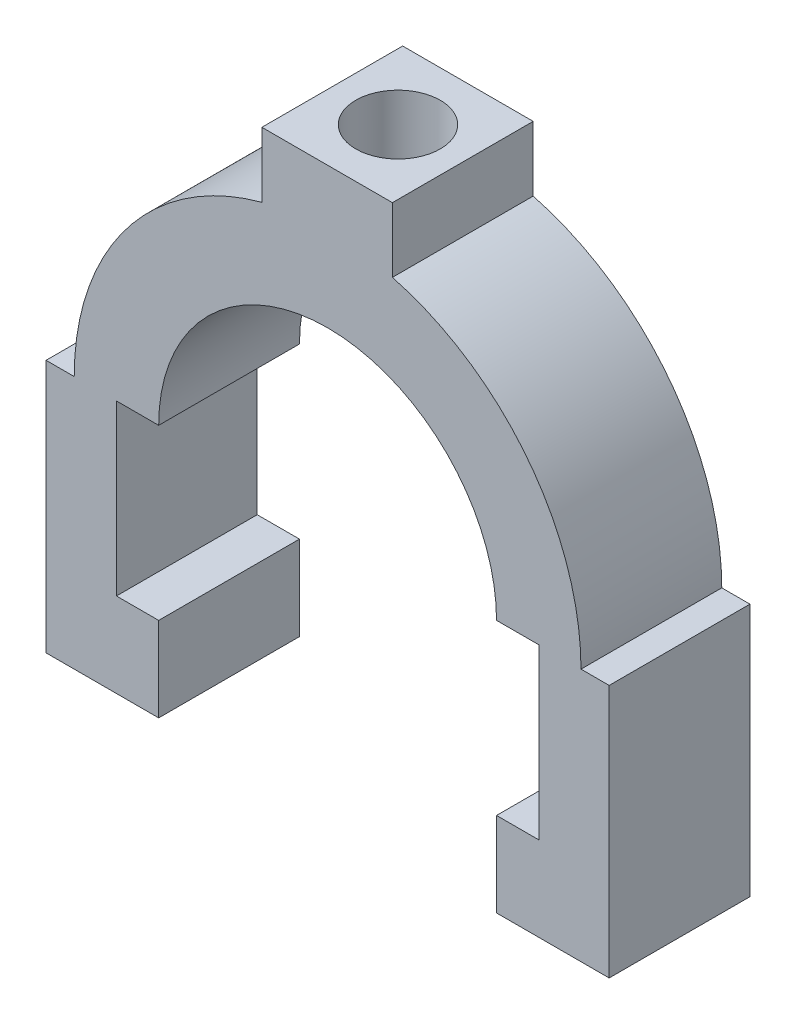
ISO-10303-21;
HEADER;
FILE_DESCRIPTION(('STEP AP214'),'2;1');
FILE_NAME('part.step','',(''),(''),'','','');
FILE_SCHEMA(('AUTOMOTIVE_DESIGN { 1 0 10303 214 1 1 1 1 }'));
ENDSEC;
DATA;
#1=APPLICATION_CONTEXT('core data for automotive mechanical design processes');
#2=APPLICATION_PROTOCOL_DEFINITION('international standard','automotive_design',2000,#1);
#3=PRODUCT_CONTEXT('',#1,'mechanical');
#4=PRODUCT('Part','Part','',(#3));
#5=PRODUCT_RELATED_PRODUCT_CATEGORY('part','',(#4));
#6=PRODUCT_DEFINITION_FORMATION('','',#4);
#7=PRODUCT_DEFINITION_CONTEXT('part definition',#1,'design');
#8=PRODUCT_DEFINITION('design','',#6,#7);
#9=PRODUCT_DEFINITION_SHAPE('','',#8);
#10=(LENGTH_UNIT() NAMED_UNIT(*) SI_UNIT(.MILLI.,.METRE.));
#11=(NAMED_UNIT(*) PLANE_ANGLE_UNIT() SI_UNIT($,.RADIAN.));
#12=(NAMED_UNIT(*) SI_UNIT($,.STERADIAN.) SOLID_ANGLE_UNIT());
#13=UNCERTAINTY_MEASURE_WITH_UNIT(LENGTH_MEASURE(1.E-05),#10,'distance_accuracy_value','');
#14=(GEOMETRIC_REPRESENTATION_CONTEXT(3) GLOBAL_UNCERTAINTY_ASSIGNED_CONTEXT((#13)) GLOBAL_UNIT_ASSIGNED_CONTEXT((#10,
#11,#12)) REPRESENTATION_CONTEXT('',''));
#15=CARTESIAN_POINT('',(0.,0.,0.));
#16=DIRECTION('',(0.,0.,1.));
#17=DIRECTION('',(1.,0.,0.));
#18=AXIS2_PLACEMENT_3D('',#15,#16,#17);
#19=CARTESIAN_POINT('',(0.,0.,20.));
#20=DIRECTION('',(0.,0.,-1.));
#21=DIRECTION('',(-1.,0.,0.));
#22=AXIS2_PLACEMENT_3D('',#19,#20,#21);
#23=CYLINDRICAL_SURFACE('',#22,36.);
#24=CARTESIAN_POINT('',(0.,0.,0.));
#25=DIRECTION('',(0.,0.,1.));
#26=DIRECTION('',(1.,0.,0.));
#27=AXIS2_PLACEMENT_3D('',#24,#25,#26);
#28=CIRCLE('',#27,36.);
#29=CARTESIAN_POINT('',(36.,0.,0.));
#30=VERTEX_POINT('',#29);
#31=CARTESIAN_POINT('',(9.20522365839567,34.8032161933192,0.));
#32=VERTEX_POINT('',#31);
#33=EDGE_CURVE('E227',#30,#32,#28,.T.);
#34=ORIENTED_EDGE('',*,*,#33,.T.);
#35=DIRECTION('',(0.,0.,-1.));
#36=VECTOR('',#35,1.);
#37=CARTESIAN_POINT('',(9.20522365839567,34.8032161933192,20.));
#38=LINE('',#37,#36);
#39=CARTESIAN_POINT('',(9.20522365839567,34.8032161933192,20.));
#40=VERTEX_POINT('',#39);
#41=EDGE_CURVE('E11',#40,#32,#38,.T.);
#42=ORIENTED_EDGE('',*,*,#41,.F.);
#43=CARTESIAN_POINT('',(0.,0.,20.));
#44=DIRECTION('',(0.,0.,1.));
#45=DIRECTION('',(1.,0.,0.));
#46=AXIS2_PLACEMENT_3D('',#43,#44,#45);
#47=CIRCLE('',#46,36.);
#48=CARTESIAN_POINT('',(36.,0.,20.));
#49=VERTEX_POINT('',#48);
#50=EDGE_CURVE('E279',#49,#40,#47,.T.);
#51=ORIENTED_EDGE('',*,*,#50,.F.);
#52=DIRECTION('',(0.,0.,-1.));
#53=VECTOR('',#52,1.);
#54=CARTESIAN_POINT('',(36.,0.,20.));
#55=LINE('',#54,#53);
#56=EDGE_CURVE('E75',#49,#30,#55,.T.);
#57=ORIENTED_EDGE('',*,*,#56,.T.);
#58=EDGE_LOOP('',(#34,#42,#51,#57));
#59=FACE_BOUND('',#58,.T.);
#60=ADVANCED_FACE('F53',(#59),#23,.T.);
#61=CARTESIAN_POINT('',(9.20522365839566,0.,20.));
#62=DIRECTION('',(-1.,0.,0.));
#63=DIRECTION('',(0.,-1.,0.));
#64=AXIS2_PLACEMENT_3D('',#61,#62,#63);
#65=PLANE('',#64);
#66=DIRECTION('',(0.,1.,0.));
#67=VECTOR('',#66,1.);
#68=CARTESIAN_POINT('',(9.20522365839566,0.,0.));
#69=LINE('',#68,#67);
#70=CARTESIAN_POINT('',(9.20522365839567,44.,0.));
#71=VERTEX_POINT('',#70);
#72=EDGE_CURVE('E229',#32,#71,#69,.T.);
#73=ORIENTED_EDGE('',*,*,#72,.T.);
#74=DIRECTION('',(0.,0.,-1.));
#75=VECTOR('',#74,1.);
#76=CARTESIAN_POINT('',(9.20522365839567,44.,20.));
#77=LINE('',#76,#75);
#78=CARTESIAN_POINT('',(9.20522365839567,44.,20.));
#79=VERTEX_POINT('',#78);
#80=EDGE_CURVE('E67',#79,#71,#77,.T.);
#81=ORIENTED_EDGE('',*,*,#80,.F.);
#82=DIRECTION('',(0.,1.,0.));
#83=VECTOR('',#82,1.);
#84=CARTESIAN_POINT('',(9.20522365839566,0.,20.));
#85=LINE('',#84,#83);
#86=EDGE_CURVE('E149',#40,#79,#85,.T.);
#87=ORIENTED_EDGE('',*,*,#86,.F.);
#88=ORIENTED_EDGE('',*,*,#41,.T.);
#89=EDGE_LOOP('',(#73,#81,#87,#88));
#90=FACE_BOUND('',#89,.T.);
#91=ADVANCED_FACE('F321',(#90),#65,.F.);
#92=CARTESIAN_POINT('',(0.,44.,20.));
#93=DIRECTION('',(0.,1.,0.));
#94=DIRECTION('',(0.,0.,1.));
#95=AXIS2_PLACEMENT_3D('',#92,#93,#94);
#96=PLANE('',#95);
#97=CARTESIAN_POINT('',(0.,44.,10.));
#98=DIRECTION('',(0.,1.,0.));
#99=DIRECTION('',(0.,0.,1.));
#100=AXIS2_PLACEMENT_3D('',#97,#98,#99);
#101=CIRCLE('',#100,6.);
#102=CARTESIAN_POINT('',(0.,44.,16.));
#103=VERTEX_POINT('',#102);
#104=EDGE_CURVE('E385',#103,#103,#101,.T.);
#105=ORIENTED_EDGE('',*,*,#104,.F.);
#106=EDGE_LOOP('',(#105));
#107=FACE_BOUND('',#106,.T.);
#108=DIRECTION('',(1.,0.,0.));
#109=VECTOR('',#108,1.);
#110=CARTESIAN_POINT('',(0.,44.,0.));
#111=LINE('',#110,#109);
#112=CARTESIAN_POINT('',(-9.33749561031693,44.,0.));
#113=VERTEX_POINT('',#112);
#114=EDGE_CURVE('E232',#113,#71,#111,.T.);
#115=ORIENTED_EDGE('',*,*,#114,.F.);
#116=DIRECTION('',(0.,0.,-1.));
#117=VECTOR('',#116,1.);
#118=CARTESIAN_POINT('',(-9.33749561031693,44.,20.));
#119=LINE('',#118,#117);
#120=CARTESIAN_POINT('',(-9.33749561031693,44.,20.));
#121=VERTEX_POINT('',#120);
#122=EDGE_CURVE('E313',#121,#113,#119,.T.);
#123=ORIENTED_EDGE('',*,*,#122,.F.);
#124=DIRECTION('',(1.,0.,0.));
#125=VECTOR('',#124,1.);
#126=CARTESIAN_POINT('',(0.,44.,20.));
#127=LINE('',#126,#125);
#128=EDGE_CURVE('E320',#121,#79,#127,.T.);
#129=ORIENTED_EDGE('',*,*,#128,.T.);
#130=ORIENTED_EDGE('',*,*,#80,.T.);
#131=EDGE_LOOP('',(#115,#123,#129,#130));
#132=FACE_BOUND('',#131,.T.);
#133=ADVANCED_FACE('F318',(#107,#132),#96,.T.);
#134=CARTESIAN_POINT('',(-9.33749561031694,0.,20.));
#135=DIRECTION('',(-1.,0.,0.));
#136=DIRECTION('',(0.,-1.,0.));
#137=AXIS2_PLACEMENT_3D('',#134,#135,#136);
#138=PLANE('',#137);
#139=DIRECTION('',(0.,1.,0.));
#140=VECTOR('',#139,1.);
#141=CARTESIAN_POINT('',(-9.33749561031694,0.,0.));
#142=LINE('',#141,#140);
#143=CARTESIAN_POINT('',(-9.33749561031693,34.7679619150636,0.));
#144=VERTEX_POINT('',#143);
#145=EDGE_CURVE('E235',#144,#113,#142,.T.);
#146=ORIENTED_EDGE('',*,*,#145,.F.);
#147=DIRECTION('',(0.,0.,-1.));
#148=VECTOR('',#147,1.);
#149=CARTESIAN_POINT('',(-9.33749561031693,34.7679619150636,20.));
#150=LINE('',#149,#148);
#151=CARTESIAN_POINT('',(-9.33749561031693,34.7679619150636,20.));
#152=VERTEX_POINT('',#151);
#153=EDGE_CURVE('E311',#152,#144,#150,.T.);
#154=ORIENTED_EDGE('',*,*,#153,.F.);
#155=DIRECTION('',(0.,1.,0.));
#156=VECTOR('',#155,1.);
#157=CARTESIAN_POINT('',(-9.33749561031694,0.,20.));
#158=LINE('',#157,#156);
#159=EDGE_CURVE('E332',#152,#121,#158,.T.);
#160=ORIENTED_EDGE('',*,*,#159,.T.);
#161=ORIENTED_EDGE('',*,*,#122,.T.);
#162=EDGE_LOOP('',(#146,#154,#160,#161));
#163=FACE_BOUND('',#162,.T.);
#164=ADVANCED_FACE('F328',(#163),#138,.T.);
#165=CARTESIAN_POINT('',(0.,0.,20.));
#166=DIRECTION('',(0.,0.,-1.));
#167=DIRECTION('',(-1.,0.,0.));
#168=AXIS2_PLACEMENT_3D('',#165,#166,#167);
#169=CYLINDRICAL_SURFACE('',#168,36.);
#170=CARTESIAN_POINT('',(0.,0.,0.));
#171=DIRECTION('',(0.,0.,1.));
#172=DIRECTION('',(1.,0.,0.));
#173=AXIS2_PLACEMENT_3D('',#170,#171,#172);
#174=CIRCLE('',#173,36.);
#175=CARTESIAN_POINT('',(-36.,0.,0.));
#176=VERTEX_POINT('',#175);
#177=EDGE_CURVE('E238',#144,#176,#174,.T.);
#178=ORIENTED_EDGE('',*,*,#177,.T.);
#179=DIRECTION('',(0.,0.,-1.));
#180=VECTOR('',#179,1.);
#181=CARTESIAN_POINT('',(-36.,0.,20.));
#182=LINE('',#181,#180);
#183=CARTESIAN_POINT('',(-36.,0.,20.));
#184=VERTEX_POINT('',#183);
#185=EDGE_CURVE('E309',#184,#176,#182,.T.);
#186=ORIENTED_EDGE('',*,*,#185,.F.);
#187=CARTESIAN_POINT('',(0.,0.,20.));
#188=DIRECTION('',(0.,0.,1.));
#189=DIRECTION('',(1.,0.,0.));
#190=AXIS2_PLACEMENT_3D('',#187,#188,#189);
#191=CIRCLE('',#190,36.);
#192=EDGE_CURVE('E334',#152,#184,#191,.T.);
#193=ORIENTED_EDGE('',*,*,#192,.F.);
#194=ORIENTED_EDGE('',*,*,#153,.T.);
#195=EDGE_LOOP('',(#178,#186,#193,#194));
#196=FACE_BOUND('',#195,.T.);
#197=ADVANCED_FACE('F443',(#196),#169,.T.);
#198=CARTESIAN_POINT('',(0.,0.,20.));
#199=DIRECTION('',(0.,1.,0.));
#200=DIRECTION('',(0.,0.,1.));
#201=AXIS2_PLACEMENT_3D('',#198,#199,#200);
#202=PLANE('',#201);
#203=DIRECTION('',(1.,0.,0.));
#204=VECTOR('',#203,1.);
#205=CARTESIAN_POINT('',(0.,0.,0.));
#206=LINE('',#205,#204);
#207=CARTESIAN_POINT('',(-40.,0.,0.));
#208=VERTEX_POINT('',#207);
#209=EDGE_CURVE('E241',#208,#176,#206,.T.);
#210=ORIENTED_EDGE('',*,*,#209,.F.);
#211=DIRECTION('',(0.,0.,-1.));
#212=VECTOR('',#211,1.);
#213=CARTESIAN_POINT('',(-40.,0.,20.));
#214=LINE('',#213,#212);
#215=CARTESIAN_POINT('',(-40.,0.,20.));
#216=VERTEX_POINT('',#215);
#217=EDGE_CURVE('E307',#216,#208,#214,.T.);
#218=ORIENTED_EDGE('',*,*,#217,.F.);
#219=DIRECTION('',(1.,0.,0.));
#220=VECTOR('',#219,1.);
#221=CARTESIAN_POINT('',(0.,0.,20.));
#222=LINE('',#221,#220);
#223=EDGE_CURVE('E340',#216,#184,#222,.T.);
#224=ORIENTED_EDGE('',*,*,#223,.T.);
#225=ORIENTED_EDGE('',*,*,#185,.T.);
#226=EDGE_LOOP('',(#210,#218,#224,#225));
#227=FACE_BOUND('',#226,.T.);
#228=ADVANCED_FACE('F438',(#227),#202,.T.);
#229=CARTESIAN_POINT('',(-40.,0.,20.));
#230=DIRECTION('',(1.,0.,0.));
#231=DIRECTION('',(0.,1.,0.));
#232=AXIS2_PLACEMENT_3D('',#229,#230,#231);
#233=PLANE('',#232);
#234=DIRECTION('',(0.,-1.,0.));
#235=VECTOR('',#234,1.);
#236=CARTESIAN_POINT('',(-40.,0.,0.));
#237=LINE('',#236,#235);
#238=CARTESIAN_POINT('',(-40.,-36.,0.));
#239=VERTEX_POINT('',#238);
#240=EDGE_CURVE('E244',#208,#239,#237,.T.);
#241=ORIENTED_EDGE('',*,*,#240,.T.);
#242=DIRECTION('',(0.,0.,-1.));
#243=VECTOR('',#242,1.);
#244=CARTESIAN_POINT('',(-40.,-36.,20.));
#245=LINE('',#244,#243);
#246=CARTESIAN_POINT('',(-40.,-36.,20.));
#247=VERTEX_POINT('',#246);
#248=EDGE_CURVE('E304',#247,#239,#245,.T.);
#249=ORIENTED_EDGE('',*,*,#248,.F.);
#250=DIRECTION('',(0.,-1.,0.));
#251=VECTOR('',#250,1.);
#252=CARTESIAN_POINT('',(-40.,0.,20.));
#253=LINE('',#252,#251);
#254=EDGE_CURVE('E343',#216,#247,#253,.T.);
#255=ORIENTED_EDGE('',*,*,#254,.F.);
#256=ORIENTED_EDGE('',*,*,#217,.T.);
#257=EDGE_LOOP('',(#241,#249,#255,#256));
#258=FACE_BOUND('',#257,.T.);
#259=ADVANCED_FACE('F444',(#258),#233,.F.);
#260=CARTESIAN_POINT('',(0.,-36.,20.));
#261=DIRECTION('',(0.,1.,0.));
#262=DIRECTION('',(0.,0.,1.));
#263=AXIS2_PLACEMENT_3D('',#260,#261,#262);
#264=PLANE('',#263);
#265=DIRECTION('',(1.,0.,0.));
#266=VECTOR('',#265,1.);
#267=CARTESIAN_POINT('',(0.,-36.,0.));
#268=LINE('',#267,#266);
#269=CARTESIAN_POINT('',(-24.,-36.,0.));
#270=VERTEX_POINT('',#269);
#271=EDGE_CURVE('E246',#239,#270,#268,.T.);
#272=ORIENTED_EDGE('',*,*,#271,.T.);
#273=DIRECTION('',(0.,0.,-1.));
#274=VECTOR('',#273,1.);
#275=CARTESIAN_POINT('',(-24.,-36.,20.));
#276=LINE('',#275,#274);
#277=CARTESIAN_POINT('',(-24.,-36.,20.));
#278=VERTEX_POINT('',#277);
#279=EDGE_CURVE('E301',#278,#270,#276,.T.);
#280=ORIENTED_EDGE('',*,*,#279,.F.);
#281=DIRECTION('',(1.,0.,0.));
#282=VECTOR('',#281,1.);
#283=CARTESIAN_POINT('',(0.,-36.,20.));
#284=LINE('',#283,#282);
#285=EDGE_CURVE('E345',#247,#278,#284,.T.);
#286=ORIENTED_EDGE('',*,*,#285,.F.);
#287=ORIENTED_EDGE('',*,*,#248,.T.);
#288=EDGE_LOOP('',(#272,#280,#286,#287));
#289=FACE_BOUND('',#288,.T.);
#290=ADVANCED_FACE('F432',(#289),#264,.F.);
#291=CARTESIAN_POINT('',(-24.,0.,20.));
#292=DIRECTION('',(-1.,0.,0.));
#293=DIRECTION('',(0.,0.,1.));
#294=AXIS2_PLACEMENT_3D('',#291,#292,#293);
#295=PLANE('',#294);
#296=DIRECTION('',(0.,1.,0.));
#297=VECTOR('',#296,1.);
#298=CARTESIAN_POINT('',(-24.,0.,0.));
#299=LINE('',#298,#297);
#300=CARTESIAN_POINT('',(-24.,-24.,0.));
#301=VERTEX_POINT('',#300);
#302=EDGE_CURVE('E248',#270,#301,#299,.T.);
#303=ORIENTED_EDGE('',*,*,#302,.T.);
#304=DIRECTION('',(0.,0.,-1.));
#305=VECTOR('',#304,1.);
#306=CARTESIAN_POINT('',(-24.,-24.,20.));
#307=LINE('',#306,#305);
#308=CARTESIAN_POINT('',(-24.,-24.,20.));
#309=VERTEX_POINT('',#308);
#310=EDGE_CURVE('E299',#309,#301,#307,.T.);
#311=ORIENTED_EDGE('',*,*,#310,.F.);
#312=DIRECTION('',(0.,1.,0.));
#313=VECTOR('',#312,1.);
#314=CARTESIAN_POINT('',(-24.,0.,20.));
#315=LINE('',#314,#313);
#316=EDGE_CURVE('E347',#278,#309,#315,.T.);
#317=ORIENTED_EDGE('',*,*,#316,.F.);
#318=ORIENTED_EDGE('',*,*,#279,.T.);
#319=EDGE_LOOP('',(#303,#311,#317,#318));
#320=FACE_BOUND('',#319,.T.);
#321=ADVANCED_FACE('F428',(#320),#295,.F.);
#322=CARTESIAN_POINT('',(0.,-24.,20.));
#323=DIRECTION('',(0.,1.,0.));
#324=DIRECTION('',(0.,0.,1.));
#325=AXIS2_PLACEMENT_3D('',#322,#323,#324);
#326=PLANE('',#325);
#327=DIRECTION('',(1.,0.,0.));
#328=VECTOR('',#327,1.);
#329=CARTESIAN_POINT('',(0.,-24.,0.));
#330=LINE('',#329,#328);
#331=CARTESIAN_POINT('',(-30.,-24.,0.));
#332=VERTEX_POINT('',#331);
#333=EDGE_CURVE('E251',#332,#301,#330,.T.);
#334=ORIENTED_EDGE('',*,*,#333,.F.);
#335=DIRECTION('',(0.,0.,-1.));
#336=VECTOR('',#335,1.);
#337=CARTESIAN_POINT('',(-30.,-24.,20.));
#338=LINE('',#337,#336);
#339=CARTESIAN_POINT('',(-30.,-24.,20.));
#340=VERTEX_POINT('',#339);
#341=EDGE_CURVE('E297',#340,#332,#338,.T.);
#342=ORIENTED_EDGE('',*,*,#341,.F.);
#343=DIRECTION('',(1.,0.,0.));
#344=VECTOR('',#343,1.);
#345=CARTESIAN_POINT('',(0.,-24.,20.));
#346=LINE('',#345,#344);
#347=EDGE_CURVE('E349',#340,#309,#346,.T.);
#348=ORIENTED_EDGE('',*,*,#347,.T.);
#349=ORIENTED_EDGE('',*,*,#310,.T.);
#350=EDGE_LOOP('',(#334,#342,#348,#349));
#351=FACE_BOUND('',#350,.T.);
#352=ADVANCED_FACE('F424',(#351),#326,.T.);
#353=CARTESIAN_POINT('',(-30.,0.,20.));
#354=DIRECTION('',(1.,0.,0.));
#355=DIRECTION('',(0.,1.,0.));
#356=AXIS2_PLACEMENT_3D('',#353,#354,#355);
#357=PLANE('',#356);
#358=DIRECTION('',(0.,-1.,0.));
#359=VECTOR('',#358,1.);
#360=CARTESIAN_POINT('',(-30.,0.,0.));
#361=LINE('',#360,#359);
#362=CARTESIAN_POINT('',(-30.,0.,0.));
#363=VERTEX_POINT('',#362);
#364=EDGE_CURVE('E254',#363,#332,#361,.T.);
#365=ORIENTED_EDGE('',*,*,#364,.F.);
#366=DIRECTION('',(0.,0.,-1.));
#367=VECTOR('',#366,1.);
#368=CARTESIAN_POINT('',(-30.,0.,20.));
#369=LINE('',#368,#367);
#370=CARTESIAN_POINT('',(-30.,0.,20.));
#371=VERTEX_POINT('',#370);
#372=EDGE_CURVE('E295',#371,#363,#369,.T.);
#373=ORIENTED_EDGE('',*,*,#372,.F.);
#374=DIRECTION('',(0.,-1.,0.));
#375=VECTOR('',#374,1.);
#376=CARTESIAN_POINT('',(-30.,0.,20.));
#377=LINE('',#376,#375);
#378=EDGE_CURVE('E352',#371,#340,#377,.T.);
#379=ORIENTED_EDGE('',*,*,#378,.T.);
#380=ORIENTED_EDGE('',*,*,#341,.T.);
#381=EDGE_LOOP('',(#365,#373,#379,#380));
#382=FACE_BOUND('',#381,.T.);
#383=ADVANCED_FACE('F419',(#382),#357,.T.);
#384=CARTESIAN_POINT('',(0.,0.,20.));
#385=DIRECTION('',(0.,1.,0.));
#386=DIRECTION('',(-1.,0.,0.));
#387=AXIS2_PLACEMENT_3D('',#384,#385,#386);
#388=PLANE('',#387);
#389=DIRECTION('',(1.,0.,0.));
#390=VECTOR('',#389,1.);
#391=CARTESIAN_POINT('',(0.,0.,0.));
#392=LINE('',#391,#390);
#393=CARTESIAN_POINT('',(-24.,0.,0.));
#394=VERTEX_POINT('',#393);
#395=EDGE_CURVE('E257',#363,#394,#392,.T.);
#396=ORIENTED_EDGE('',*,*,#395,.T.);
#397=DIRECTION('',(0.,0.,-1.));
#398=VECTOR('',#397,1.);
#399=CARTESIAN_POINT('',(-24.,0.,20.));
#400=LINE('',#399,#398);
#401=CARTESIAN_POINT('',(-24.,0.,20.));
#402=VERTEX_POINT('',#401);
#403=EDGE_CURVE('E293',#402,#394,#400,.T.);
#404=ORIENTED_EDGE('',*,*,#403,.F.);
#405=DIRECTION('',(1.,0.,0.));
#406=VECTOR('',#405,1.);
#407=CARTESIAN_POINT('',(0.,0.,20.));
#408=LINE('',#407,#406);
#409=EDGE_CURVE('E355',#371,#402,#408,.T.);
#410=ORIENTED_EDGE('',*,*,#409,.F.);
#411=ORIENTED_EDGE('',*,*,#372,.T.);
#412=EDGE_LOOP('',(#396,#404,#410,#411));
#413=FACE_BOUND('',#412,.T.);
#414=ADVANCED_FACE('F398',(#413),#388,.F.);
#415=CARTESIAN_POINT('',(0.,0.,20.));
#416=DIRECTION('',(0.,0.,-1.));
#417=DIRECTION('',(-1.,0.,0.));
#418=AXIS2_PLACEMENT_3D('',#415,#416,#417);
#419=CYLINDRICAL_SURFACE('',#418,24.);
#420=CARTESIAN_POINT('',(0.,24.,16.));
#421=CARTESIAN_POINT('',(-0.165805387403802,24.0000029962767,16.0000049489736));
#422=CARTESIAN_POINT('',(-0.331556618095783,23.9982792337243,15.9931261251076));
#423=CARTESIAN_POINT('',(-0.661898341499742,23.9914389070726,15.9656801379836));
#424=CARTESIAN_POINT('',(-0.826488699612241,23.9863219558732,15.9451114129598));
#425=CARTESIAN_POINT('',(-1.15331468289425,23.9728312747808,15.8904442806045));
#426=CARTESIAN_POINT('',(-1.31554956136034,23.964456534561,15.8563416759915));
#427=CARTESIAN_POINT('',(-1.63652999353389,23.9446785682942,15.7748760721035));
#428=CARTESIAN_POINT('',(-1.7952742379173,23.9332742261501,15.7275081855849));
#429=CARTESIAN_POINT('',(-2.10785890827135,23.9077704080524,15.6199828017296));
#430=CARTESIAN_POINT('',(-2.26170674963502,23.8936752583917,15.5598458174177));
#431=CARTESIAN_POINT('',(-2.56378623821258,23.8631527081916,15.4271745897842));
#432=CARTESIAN_POINT('',(-2.71201578712804,23.8467244469549,15.3546357693375));
#433=CARTESIAN_POINT('',(-3.00177661033544,23.8119848981805,15.1977372548709));
#434=CARTESIAN_POINT('',(-3.1433102969363,23.7936742964517,15.1133818620482));
#435=CARTESIAN_POINT('',(-3.41888526654491,23.7556431475739,14.9333882354096));
#436=CARTESIAN_POINT('',(-3.5529237053449,23.7359220715781,14.8377457607558));
#437=CARTESIAN_POINT('',(-3.81496434602383,23.6952304700178,14.6340140827509));
#438=CARTESIAN_POINT('',(-3.94281308913214,23.674243775966,14.5257306874444));
#439=CARTESIAN_POINT('',(-4.18902736841679,23.6319204183454,14.298846966889));
#440=CARTESIAN_POINT('',(-4.30738936846955,23.6105836278175,14.1802428286891));
#441=CARTESIAN_POINT('',(-4.53377489524013,23.5681596204781,13.9335611167013));
#442=CARTESIAN_POINT('',(-4.64180103185487,23.5470723418473,13.8054859489905));
#443=CARTESIAN_POINT('',(-4.8468631629984,23.5057198367545,13.5406185834632));
#444=CARTESIAN_POINT('',(-4.94389508557169,23.4854549166434,13.403823185034));
#445=CARTESIAN_POINT('',(-5.12757579334233,23.4460427828086,13.1203993860544));
#446=CARTESIAN_POINT('',(-5.21405329073272,23.4269160793509,12.9736570210366));
#447=CARTESIAN_POINT('',(-5.37434099239073,23.3906650895731,12.6731036888584));
#448=CARTESIAN_POINT('',(-5.4481464054103,23.3735415614194,12.5192900758401));
#449=CARTESIAN_POINT('',(-5.5824381696205,23.3418328254504,12.205771190017));
#450=CARTESIAN_POINT('',(-5.6429311270007,23.3272463593972,12.046068885572));
#451=CARTESIAN_POINT('',(-5.75016256060697,23.301043510543,11.7218770109329));
#452=CARTESIAN_POINT('',(-5.79689611131117,23.2894281915328,11.5573857495113));
#453=CARTESIAN_POINT('',(-5.91415157316671,23.2600431044562,11.0651783074134));
#454=CARTESIAN_POINT('',(-5.96458986092325,23.2470332112981,10.7320163829238));
#455=CARTESIAN_POINT('',(-5.99795848349603,23.23842608856,10.2298515486397));
#456=CARTESIAN_POINT('',(-6.00202663613951,23.2373766993858,10.0619945228305));
#457=CARTESIAN_POINT('',(-5.99610970800768,23.2389046091482,9.72652435084421));
#458=CARTESIAN_POINT('',(-5.98612448822742,23.2414819439575,9.55891120709583));
#459=CARTESIAN_POINT('',(-5.93594713474591,23.2543754061852,9.0665242382291));
#460=CARTESIAN_POINT('',(-5.87607363848321,23.2697164452628,8.74366776503005));
#461=CARTESIAN_POINT('',(-5.70489646981085,23.3122664593645,8.11290554174151));
#462=CARTESIAN_POINT('',(-5.59358913348968,23.3394762798586,7.80500085847619));
#463=CARTESIAN_POINT('',(-5.32155798729425,23.4030050803748,7.20906160097685));
#464=CARTESIAN_POINT('',(-5.16034668919655,23.4394132393811,6.92125897835464));
#465=CARTESIAN_POINT('',(-4.79342508379137,23.5171882932266,6.37632149481797));
#466=CARTESIAN_POINT('',(-4.58770698972655,23.5585560552156,6.11919201259972));
#467=CARTESIAN_POINT('',(-4.13065370439076,23.6430352608536,5.63518656072918));
#468=CARTESIAN_POINT('',(-3.8781850342093,23.6861627896442,5.40938231393944));
#469=CARTESIAN_POINT('',(-3.33844766846889,23.7682386126258,5.00311475595117));
#470=CARTESIAN_POINT('',(-3.05117791031428,23.8071867791381,4.82265282972543));
#471=CARTESIAN_POINT('',(-2.44846355524484,23.8767092866156,4.51179772857426));
#472=CARTESIAN_POINT('',(-2.1329255733586,23.9072544059235,4.38157865729419));
#473=CARTESIAN_POINT('',(-1.48350403204752,23.9563166788424,4.17633075885331));
#474=CARTESIAN_POINT('',(-1.14962399502517,23.9748361331613,4.10129137454455));
#475=CARTESIAN_POINT('',(-0.482159883096529,23.9974199712544,4.0101697375531));
#476=CARTESIAN_POINT('',(-0.148786885522351,24.0018421411353,3.9926278774801));
#477=CARTESIAN_POINT('',(0.516131504775039,23.9967521917739,4.012996026439));
#478=CARTESIAN_POINT('',(0.847677059317267,23.987241326857,4.05090104384998));
#479=CARTESIAN_POINT('',(1.4944570546744,23.9555832478694,4.17988356198871));
#480=CARTESIAN_POINT('',(1.80986040015949,23.9336253776701,4.27016478740322));
#481=CARTESIAN_POINT('',(2.42102924553322,23.8795482551267,4.50042860264544));
#482=CARTESIAN_POINT('',(2.71679275860286,23.8474279766146,4.64041621184185));
#483=CARTESIAN_POINT('',(3.28609225023473,23.775732355911,4.96894350326124));
#484=CARTESIAN_POINT('',(3.55914068563651,23.7360348408855,5.15830064078757));
#485=CARTESIAN_POINT('',(4.07010753646663,23.6537802212633,5.5791634446452));
#486=CARTESIAN_POINT('',(4.30801987625634,23.6112226239559,5.81067638502544));
#487=CARTESIAN_POINT('',(4.74795813275243,23.526758837948,6.31599326761707));
#488=CARTESIAN_POINT('',(4.94895984477464,23.4848942795269,6.59069579218291));
#489=CARTESIAN_POINT('',(5.30205866107055,23.4077130231476,7.17098555524694));
#490=CARTESIAN_POINT('',(5.45415793615243,23.3723960345683,7.47657142202354));
#491=CARTESIAN_POINT('',(5.64160870712871,23.3275859445682,7.95036011901536));
#492=CARTESIAN_POINT('',(5.69722158138528,23.3140336618751,8.11044327829627));
#493=CARTESIAN_POINT('',(5.79475769208555,23.2899834650234,8.43493482969514));
#494=CARTESIAN_POINT('',(5.83668611505733,23.2794843938355,8.59934155755361));
#495=CARTESIAN_POINT('',(5.9064899745362,23.2618715740422,8.93128294865933));
#496=CARTESIAN_POINT('',(5.93436517338602,23.2547578826878,9.09881766475502));
#497=CARTESIAN_POINT('',(5.97582085063046,23.2441396190328,9.43575786636507));
#498=CARTESIAN_POINT('',(5.98940200008078,23.2406348773048,9.60516326368014));
#499=CARTESIAN_POINT('',(6.0019634728535,23.2373938489065,9.93966894494398));
#500=CARTESIAN_POINT('',(6.0013522054121,23.2375521518778,10.1047530313471));
#501=CARTESIAN_POINT('',(5.98653576306369,23.2413736324535,10.4342665001569));
#502=CARTESIAN_POINT('',(5.97233089751311,23.2450367302975,10.598695897377));
#503=CARTESIAN_POINT('',(5.93044575509701,23.2557579721328,10.9257410344122));
#504=CARTESIAN_POINT('',(5.90276341290372,23.2628166364686,11.0883564923458));
#505=CARTESIAN_POINT('',(5.83416667908453,23.2801148571724,11.4105376668584));
#506=CARTESIAN_POINT('',(5.79325695086328,23.2903532924405,11.5701044373057));
#507=CARTESIAN_POINT('',(5.69880203716712,23.313644179093,11.8842523863261));
#508=CARTESIAN_POINT('',(5.64532943643257,23.3266804293978,12.0388566126103));
#509=CARTESIAN_POINT('',(5.52605852883571,23.3552228194459,12.3429342235871));
#510=CARTESIAN_POINT('',(5.46026449802037,23.3707281020539,12.4924093670543));
#511=CARTESIAN_POINT('',(5.31678835542035,23.4037855982137,12.7853867449869));
#512=CARTESIAN_POINT('',(5.23910089912543,23.4213387311534,12.9288862571421));
#513=CARTESIAN_POINT('',(5.07243073970643,23.4579990976357,13.208891456609));
#514=CARTESIAN_POINT('',(4.98345174049215,23.4771058208267,13.3453994168081));
#515=CARTESIAN_POINT('',(4.7922729032838,23.5168854335111,13.6141426790837));
#516=CARTESIAN_POINT('',(4.68978556121475,23.5375863850894,13.7461693832206));
#517=CARTESIAN_POINT('',(4.4742434518464,23.579507882839,14.001125128433));
#518=CARTESIAN_POINT('',(4.36119228671727,23.6007282500856,14.1240572452482));
#519=CARTESIAN_POINT('',(4.12516419546941,23.6431258862839,14.3601488853344));
#520=CARTESIAN_POINT('',(4.0021814457299,23.6643031223737,14.4733025931207));
#521=CARTESIAN_POINT('',(3.7471917650141,23.7060168559165,14.6889686779036));
#522=CARTESIAN_POINT('',(3.61518813420472,23.7265535837286,14.7914849122748));
#523=CARTESIAN_POINT('',(3.34044186706076,23.7668061369628,14.9870231939444));
#524=CARTESIAN_POINT('',(3.19754553860501,23.7864996932668,15.0798340610588));
#525=CARTESIAN_POINT('',(2.90425652857033,23.824087485808,15.253026701334));
#526=CARTESIAN_POINT('',(2.75386663022821,23.8419823827553,15.3334130443325));
#527=CARTESIAN_POINT('',(2.44663692885417,23.8754647710401,15.4811494871589));
#528=CARTESIAN_POINT('',(2.2897999415517,23.8910532562916,15.5485052062122));
#529=CARTESIAN_POINT('',(1.97079001830644,23.9194829588902,15.6696663554929));
#530=CARTESIAN_POINT('',(1.80861789148403,23.9323245906257,15.723473829816));
#531=CARTESIAN_POINT('',(1.3777763047293,23.9619049568243,15.8462328539043));
#532=CARTESIAN_POINT('',(1.1055914726577,23.9761014751911,15.9037953778407));
#533=CARTESIAN_POINT('',(0.555553502444541,23.9951461360495,15.980673368139));
#534=CARTESIAN_POINT('',(0.277700792219541,23.9999949816564,15.9999917111627));
#535=CARTESIAN_POINT('',(0.,24.,16.));
#536=B_SPLINE_CURVE_WITH_KNOTS('',3,(#420,#421,#422,#423,#424,#425,#426,#427,#428,#429,#430,
#431,#432,#433,#434,#435,#436,#437,#438,#439,#440,#441,#442,#443,#444,#445,#446,#447,#448,#449,
#450,#451,#452,#453,#454,#455,#456,#457,#458,#459,#460,#461,#462,#463,#464,#465,#466,#467,#468,
#469,#470,#471,#472,#473,#474,#475,#476,#477,#478,#479,#480,#481,#482,#483,#484,#485,#486,#487,
#488,#489,#490,#491,#492,#493,#494,#495,#496,#497,#498,#499,#500,#501,#502,#503,#504,#505,#506,
#507,#508,#509,#510,#511,#512,#513,#514,#515,#516,#517,#518,#519,#520,#521,#522,#523,#524,#525,
#526,#527,#528,#529,#530,#531,#532,#533,#534,#535),.UNSPECIFIED.,.T.,.F.,(4,2,2,2,2,2,2,2,2,2,2,
2,2,2,2,2,2,2,2,2,2,2,2,2,2,2,2,2,2,2,2,2,2,2,2,2,2,2,2,2,2,2,2,2,2,2,2,2,2,2,2,2,2,2,2,2,2,4),
(0.,0.497171453608337,0.994399635056343,1.49178214324908,1.98934814054333,2.48612078574438,
2.98307717135303,3.47985313409878,3.97681634579052,4.48278784834555,4.98894707988207,
5.49497816255321,6.00119605682159,6.51476681838441,7.02853133276357,7.54204031819885,
8.0557329040678,9.06140626133586,9.56463055957973,10.0678598353591,11.0489981911534,
12.0302064495334,13.021319425847,14.0126059443384,15.0321583496526,16.0517418932217,
17.0748274712564,18.0977172584376,19.0944306688629,20.0910543554016,21.0729092914533,
22.0548634037835,23.0542418135059,24.0537928312126,25.0778786790709,26.1019190608722,
26.6114255778037,27.1207387624019,27.6300605598219,28.1393584452954,28.6340191333343,
29.1286685643954,29.6233938208458,30.1179448483897,30.6097058740945,31.10129655354,
31.593108789452,32.0847601135969,32.5894192432003,33.0939069121446,33.5986925778495,
34.1032945530713,34.6172488082312,35.1310135748031,35.6445562931573,36.1580214841036,
36.9907766489356,37.8234691729712),.UNSPECIFIED.);
#537=CARTESIAN_POINT('',(0.,24.,16.));
#538=VERTEX_POINT('',#537);
#539=EDGE_CURVE('E56',#538,#538,#536,.T.);
#540=ORIENTED_EDGE('',*,*,#539,.F.);
#541=EDGE_LOOP('',(#540));
#542=FACE_BOUND('',#541,.T.);
#543=CARTESIAN_POINT('',(0.,0.,0.));
#544=DIRECTION('',(0.,0.,1.));
#545=DIRECTION('',(1.,0.,0.));
#546=AXIS2_PLACEMENT_3D('',#543,#544,#545);
#547=CIRCLE('',#546,24.);
#548=CARTESIAN_POINT('',(24.,0.,0.));
#549=VERTEX_POINT('',#548);
#550=EDGE_CURVE('E260',#549,#394,#547,.T.);
#551=ORIENTED_EDGE('',*,*,#550,.F.);
#552=DIRECTION('',(0.,0.,-1.));
#553=VECTOR('',#552,1.);
#554=CARTESIAN_POINT('',(24.,0.,20.));
#555=LINE('',#554,#553);
#556=CARTESIAN_POINT('',(24.,0.,20.));
#557=VERTEX_POINT('',#556);
#558=EDGE_CURVE('E291',#557,#549,#555,.T.);
#559=ORIENTED_EDGE('',*,*,#558,.F.);
#560=CARTESIAN_POINT('',(0.,0.,20.));
#561=DIRECTION('',(0.,0.,1.));
#562=DIRECTION('',(1.,0.,0.));
#563=AXIS2_PLACEMENT_3D('',#560,#561,#562);
#564=CIRCLE('',#563,24.);
#565=EDGE_CURVE('E357',#557,#402,#564,.T.);
#566=ORIENTED_EDGE('',*,*,#565,.T.);
#567=ORIENTED_EDGE('',*,*,#403,.T.);
#568=EDGE_LOOP('',(#551,#559,#566,#567));
#569=FACE_BOUND('',#568,.T.);
#570=ADVANCED_FACE('F394',(#542,#569),#419,.F.);
#571=CARTESIAN_POINT('',(0.,0.,20.));
#572=DIRECTION('',(0.,1.,0.));
#573=DIRECTION('',(0.,0.,1.));
#574=AXIS2_PLACEMENT_3D('',#571,#572,#573);
#575=PLANE('',#574);
#576=DIRECTION('',(1.,0.,0.));
#577=VECTOR('',#576,1.);
#578=CARTESIAN_POINT('',(0.,0.,0.));
#579=LINE('',#578,#577);
#580=CARTESIAN_POINT('',(30.,0.,0.));
#581=VERTEX_POINT('',#580);
#582=EDGE_CURVE('E263',#549,#581,#579,.T.);
#583=ORIENTED_EDGE('',*,*,#582,.T.);
#584=DIRECTION('',(0.,0.,-1.));
#585=VECTOR('',#584,1.);
#586=CARTESIAN_POINT('',(30.,0.,20.));
#587=LINE('',#586,#585);
#588=CARTESIAN_POINT('',(30.,0.,20.));
#589=VERTEX_POINT('',#588);
#590=EDGE_CURVE('E288',#589,#581,#587,.T.);
#591=ORIENTED_EDGE('',*,*,#590,.F.);
#592=DIRECTION('',(1.,0.,0.));
#593=VECTOR('',#592,1.);
#594=CARTESIAN_POINT('',(0.,0.,20.));
#595=LINE('',#594,#593);
#596=EDGE_CURVE('E360',#557,#589,#595,.T.);
#597=ORIENTED_EDGE('',*,*,#596,.F.);
#598=ORIENTED_EDGE('',*,*,#558,.T.);
#599=EDGE_LOOP('',(#583,#591,#597,#598));
#600=FACE_BOUND('',#599,.T.);
#601=ADVANCED_FACE('F397',(#600),#575,.F.);
#602=CARTESIAN_POINT('',(30.,0.,20.));
#603=DIRECTION('',(1.,0.,0.));
#604=DIRECTION('',(0.,1.,0.));
#605=AXIS2_PLACEMENT_3D('',#602,#603,#604);
#606=PLANE('',#605);
#607=DIRECTION('',(0.,-1.,0.));
#608=VECTOR('',#607,1.);
#609=CARTESIAN_POINT('',(30.,0.,0.));
#610=LINE('',#609,#608);
#611=CARTESIAN_POINT('',(30.,-24.,0.));
#612=VERTEX_POINT('',#611);
#613=EDGE_CURVE('E265',#581,#612,#610,.T.);
#614=ORIENTED_EDGE('',*,*,#613,.T.);
#615=DIRECTION('',(0.,0.,-1.));
#616=VECTOR('',#615,1.);
#617=CARTESIAN_POINT('',(30.,-24.,20.));
#618=LINE('',#617,#616);
#619=CARTESIAN_POINT('',(30.,-24.,20.));
#620=VERTEX_POINT('',#619);
#621=EDGE_CURVE('E285',#620,#612,#618,.T.);
#622=ORIENTED_EDGE('',*,*,#621,.F.);
#623=DIRECTION('',(0.,-1.,0.));
#624=VECTOR('',#623,1.);
#625=CARTESIAN_POINT('',(30.,0.,20.));
#626=LINE('',#625,#624);
#627=EDGE_CURVE('E362',#589,#620,#626,.T.);
#628=ORIENTED_EDGE('',*,*,#627,.F.);
#629=ORIENTED_EDGE('',*,*,#590,.T.);
#630=EDGE_LOOP('',(#614,#622,#628,#629));
#631=FACE_BOUND('',#630,.T.);
#632=ADVANCED_FACE('F410',(#631),#606,.F.);
#633=CARTESIAN_POINT('',(0.,-24.,20.));
#634=DIRECTION('',(0.,-1.,0.));
#635=DIRECTION('',(1.,0.,0.));
#636=AXIS2_PLACEMENT_3D('',#633,#634,#635);
#637=PLANE('',#636);
#638=DIRECTION('',(-1.,0.,0.));
#639=VECTOR('',#638,1.);
#640=CARTESIAN_POINT('',(0.,-24.,0.));
#641=LINE('',#640,#639);
#642=CARTESIAN_POINT('',(24.,-24.,0.));
#643=VERTEX_POINT('',#642);
#644=EDGE_CURVE('E267',#612,#643,#641,.T.);
#645=ORIENTED_EDGE('',*,*,#644,.T.);
#646=DIRECTION('',(0.,0.,-1.));
#647=VECTOR('',#646,1.);
#648=CARTESIAN_POINT('',(24.,-24.,20.));
#649=LINE('',#648,#647);
#650=CARTESIAN_POINT('',(24.,-24.,20.));
#651=VERTEX_POINT('',#650);
#652=EDGE_CURVE('E283',#651,#643,#649,.T.);
#653=ORIENTED_EDGE('',*,*,#652,.F.);
#654=DIRECTION('',(-1.,0.,0.));
#655=VECTOR('',#654,1.);
#656=CARTESIAN_POINT('',(0.,-24.,20.));
#657=LINE('',#656,#655);
#658=EDGE_CURVE('E364',#620,#651,#657,.T.);
#659=ORIENTED_EDGE('',*,*,#658,.F.);
#660=ORIENTED_EDGE('',*,*,#621,.T.);
#661=EDGE_LOOP('',(#645,#653,#659,#660));
#662=FACE_BOUND('',#661,.T.);
#663=ADVANCED_FACE('F507',(#662),#637,.F.);
#664=CARTESIAN_POINT('',(24.,0.,20.));
#665=DIRECTION('',(-1.,0.,0.));
#666=DIRECTION('',(0.,-1.,0.));
#667=AXIS2_PLACEMENT_3D('',#664,#665,#666);
#668=PLANE('',#667);
#669=DIRECTION('',(0.,1.,0.));
#670=VECTOR('',#669,1.);
#671=CARTESIAN_POINT('',(24.,0.,0.));
#672=LINE('',#671,#670);
#673=CARTESIAN_POINT('',(24.,-36.,0.));
#674=VERTEX_POINT('',#673);
#675=EDGE_CURVE('E270',#674,#643,#672,.T.);
#676=ORIENTED_EDGE('',*,*,#675,.F.);
#677=DIRECTION('',(0.,0.,-1.));
#678=VECTOR('',#677,1.);
#679=CARTESIAN_POINT('',(24.,-36.,20.));
#680=LINE('',#679,#678);
#681=CARTESIAN_POINT('',(24.,-36.,20.));
#682=VERTEX_POINT('',#681);
#683=EDGE_CURVE('E210',#682,#674,#680,.T.);
#684=ORIENTED_EDGE('',*,*,#683,.F.);
#685=DIRECTION('',(0.,1.,0.));
#686=VECTOR('',#685,1.);
#687=CARTESIAN_POINT('',(24.,0.,20.));
#688=LINE('',#687,#686);
#689=EDGE_CURVE('E219',#682,#651,#688,.T.);
#690=ORIENTED_EDGE('',*,*,#689,.T.);
#691=ORIENTED_EDGE('',*,*,#652,.T.);
#692=EDGE_LOOP('',(#676,#684,#690,#691));
#693=FACE_BOUND('',#692,.T.);
#694=ADVANCED_FACE('F367',(#693),#668,.T.);
#695=CARTESIAN_POINT('',(0.,-36.,20.));
#696=DIRECTION('',(0.,-1.,0.));
#697=DIRECTION('',(0.,0.,-1.));
#698=AXIS2_PLACEMENT_3D('',#695,#696,#697);
#699=PLANE('',#698);
#700=DIRECTION('',(-1.,0.,0.));
#701=VECTOR('',#700,1.);
#702=CARTESIAN_POINT('',(0.,-36.,0.));
#703=LINE('',#702,#701);
#704=CARTESIAN_POINT('',(40.,-36.,0.));
#705=VERTEX_POINT('',#704);
#706=EDGE_CURVE('E206',#705,#674,#703,.T.);
#707=ORIENTED_EDGE('',*,*,#706,.F.);
#708=DIRECTION('',(0.,0.,-1.));
#709=VECTOR('',#708,1.);
#710=CARTESIAN_POINT('',(40.,-36.,20.));
#711=LINE('',#710,#709);
#712=CARTESIAN_POINT('',(40.,-36.,20.));
#713=VERTEX_POINT('',#712);
#714=EDGE_CURVE('E201',#713,#705,#711,.T.);
#715=ORIENTED_EDGE('',*,*,#714,.F.);
#716=DIRECTION('',(-1.,0.,0.));
#717=VECTOR('',#716,1.);
#718=CARTESIAN_POINT('',(0.,-36.,20.));
#719=LINE('',#718,#717);
#720=EDGE_CURVE('E204',#713,#682,#719,.T.);
#721=ORIENTED_EDGE('',*,*,#720,.T.);
#722=ORIENTED_EDGE('',*,*,#683,.T.);
#723=EDGE_LOOP('',(#707,#715,#721,#722));
#724=FACE_BOUND('',#723,.T.);
#725=ADVANCED_FACE('F203',(#724),#699,.T.);
#726=CARTESIAN_POINT('',(40.,0.,20.));
#727=DIRECTION('',(1.,0.,0.));
#728=DIRECTION('',(0.,0.,-1.));
#729=AXIS2_PLACEMENT_3D('',#726,#727,#728);
#730=PLANE('',#729);
#731=DIRECTION('',(0.,-1.,0.));
#732=VECTOR('',#731,1.);
#733=CARTESIAN_POINT('',(40.,0.,0.));
#734=LINE('',#733,#732);
#735=CARTESIAN_POINT('',(40.,0.,0.));
#736=VERTEX_POINT('',#735);
#737=EDGE_CURVE('E274',#736,#705,#734,.T.);
#738=ORIENTED_EDGE('',*,*,#737,.F.);
#739=DIRECTION('',(0.,0.,-1.));
#740=VECTOR('',#739,1.);
#741=CARTESIAN_POINT('',(40.,0.,20.));
#742=LINE('',#741,#740);
#743=CARTESIAN_POINT('',(40.,0.,20.));
#744=VERTEX_POINT('',#743);
#745=EDGE_CURVE('E137',#744,#736,#742,.T.);
#746=ORIENTED_EDGE('',*,*,#745,.F.);
#747=DIRECTION('',(0.,-1.,0.));
#748=VECTOR('',#747,1.);
#749=CARTESIAN_POINT('',(40.,0.,20.));
#750=LINE('',#749,#748);
#751=EDGE_CURVE('E217',#744,#713,#750,.T.);
#752=ORIENTED_EDGE('',*,*,#751,.T.);
#753=ORIENTED_EDGE('',*,*,#714,.T.);
#754=EDGE_LOOP('',(#738,#746,#752,#753));
#755=FACE_BOUND('',#754,.T.);
#756=ADVANCED_FACE('F221',(#755),#730,.T.);
#757=CARTESIAN_POINT('',(0.,0.,20.));
#758=DIRECTION('',(0.,1.,0.));
#759=DIRECTION('',(0.,0.,1.));
#760=AXIS2_PLACEMENT_3D('',#757,#758,#759);
#761=PLANE('',#760);
#762=DIRECTION('',(1.,0.,0.));
#763=VECTOR('',#762,1.);
#764=CARTESIAN_POINT('',(0.,0.,0.));
#765=LINE('',#764,#763);
#766=EDGE_CURVE('E276',#30,#736,#765,.T.);
#767=ORIENTED_EDGE('',*,*,#766,.F.);
#768=ORIENTED_EDGE('',*,*,#56,.F.);
#769=DIRECTION('',(1.,0.,0.));
#770=VECTOR('',#769,1.);
#771=CARTESIAN_POINT('',(0.,0.,20.));
#772=LINE('',#771,#770);
#773=EDGE_CURVE('E222',#49,#744,#772,.T.);
#774=ORIENTED_EDGE('',*,*,#773,.T.);
#775=ORIENTED_EDGE('',*,*,#745,.T.);
#776=EDGE_LOOP('',(#767,#768,#774,#775));
#777=FACE_BOUND('',#776,.T.);
#778=ADVANCED_FACE('F370',(#777),#761,.T.);
#779=CARTESIAN_POINT('',(0.,0.,20.));
#780=DIRECTION('',(0.,0.,1.));
#781=DIRECTION('',(1.,0.,0.));
#782=AXIS2_PLACEMENT_3D('',#779,#780,#781);
#783=PLANE('',#782);
#784=ORIENTED_EDGE('',*,*,#50,.T.);
#785=ORIENTED_EDGE('',*,*,#86,.T.);
#786=ORIENTED_EDGE('',*,*,#128,.F.);
#787=ORIENTED_EDGE('',*,*,#159,.F.);
#788=ORIENTED_EDGE('',*,*,#192,.T.);
#789=ORIENTED_EDGE('',*,*,#223,.F.);
#790=ORIENTED_EDGE('',*,*,#254,.T.);
#791=ORIENTED_EDGE('',*,*,#285,.T.);
#792=ORIENTED_EDGE('',*,*,#316,.T.);
#793=ORIENTED_EDGE('',*,*,#347,.F.);
#794=ORIENTED_EDGE('',*,*,#378,.F.);
#795=ORIENTED_EDGE('',*,*,#409,.T.);
#796=ORIENTED_EDGE('',*,*,#565,.F.);
#797=ORIENTED_EDGE('',*,*,#596,.T.);
#798=ORIENTED_EDGE('',*,*,#627,.T.);
#799=ORIENTED_EDGE('',*,*,#658,.T.);
#800=ORIENTED_EDGE('',*,*,#689,.F.);
#801=ORIENTED_EDGE('',*,*,#720,.F.);
#802=ORIENTED_EDGE('',*,*,#751,.F.);
#803=ORIENTED_EDGE('',*,*,#773,.F.);
#804=EDGE_LOOP('',(#784,#785,#786,#787,#788,#789,#790,#791,#792,#793,#794,#795,#796,#797,#798,
#799,#800,#801,#802,#803));
#805=FACE_BOUND('',#804,.T.);
#806=ADVANCED_FACE('F215',(#805),#783,.T.);
#807=CARTESIAN_POINT('',(0.,0.,0.));
#808=DIRECTION('',(0.,0.,1.));
#809=DIRECTION('',(1.,0.,0.));
#810=AXIS2_PLACEMENT_3D('',#807,#808,#809);
#811=PLANE('',#810);
#812=ORIENTED_EDGE('',*,*,#33,.F.);
#813=ORIENTED_EDGE('',*,*,#766,.T.);
#814=ORIENTED_EDGE('',*,*,#737,.T.);
#815=ORIENTED_EDGE('',*,*,#706,.T.);
#816=ORIENTED_EDGE('',*,*,#675,.T.);
#817=ORIENTED_EDGE('',*,*,#644,.F.);
#818=ORIENTED_EDGE('',*,*,#613,.F.);
#819=ORIENTED_EDGE('',*,*,#582,.F.);
#820=ORIENTED_EDGE('',*,*,#550,.T.);
#821=ORIENTED_EDGE('',*,*,#395,.F.);
#822=ORIENTED_EDGE('',*,*,#364,.T.);
#823=ORIENTED_EDGE('',*,*,#333,.T.);
#824=ORIENTED_EDGE('',*,*,#302,.F.);
#825=ORIENTED_EDGE('',*,*,#271,.F.);
#826=ORIENTED_EDGE('',*,*,#240,.F.);
#827=ORIENTED_EDGE('',*,*,#209,.T.);
#828=ORIENTED_EDGE('',*,*,#177,.F.);
#829=ORIENTED_EDGE('',*,*,#145,.T.);
#830=ORIENTED_EDGE('',*,*,#114,.T.);
#831=ORIENTED_EDGE('',*,*,#72,.F.);
#832=EDGE_LOOP('',(#812,#813,#814,#815,#816,#817,#818,#819,#820,#821,#822,#823,#824,#825,#826,
#827,#828,#829,#830,#831));
#833=FACE_BOUND('',#832,.T.);
#834=ADVANCED_FACE('F324',(#833),#811,.F.);
#835=CARTESIAN_POINT('',(0.,-36.,10.));
#836=DIRECTION('',(0.,1.,0.));
#837=DIRECTION('',(0.,0.,1.));
#838=AXIS2_PLACEMENT_3D('',#835,#836,#837);
#839=CYLINDRICAL_SURFACE('',#838,6.);
#840=ORIENTED_EDGE('',*,*,#539,.T.);
#841=EDGE_LOOP('',(#840));
#842=FACE_BOUND('',#841,.T.);
#843=ORIENTED_EDGE('',*,*,#104,.T.);
#844=EDGE_LOOP('',(#843));
#845=FACE_BOUND('',#844,.T.);
#846=ADVANCED_FACE('F392',(#842,#845),#839,.F.);
#847=CLOSED_SHELL('',(#60,#91,#133,#164,#197,#228,#259,#290,#321,#352,#383,#414,#570,#601,#632,
#663,#694,#725,#756,#778,#806,#834,#846));
#848=MANIFOLD_SOLID_BREP('B2',#847);
#849=ADVANCED_BREP_SHAPE_REPRESENTATION('',(#18,#848),#14);
#850=SHAPE_DEFINITION_REPRESENTATION(#9,#849);
ENDSEC;
END-ISO-10303-21;
